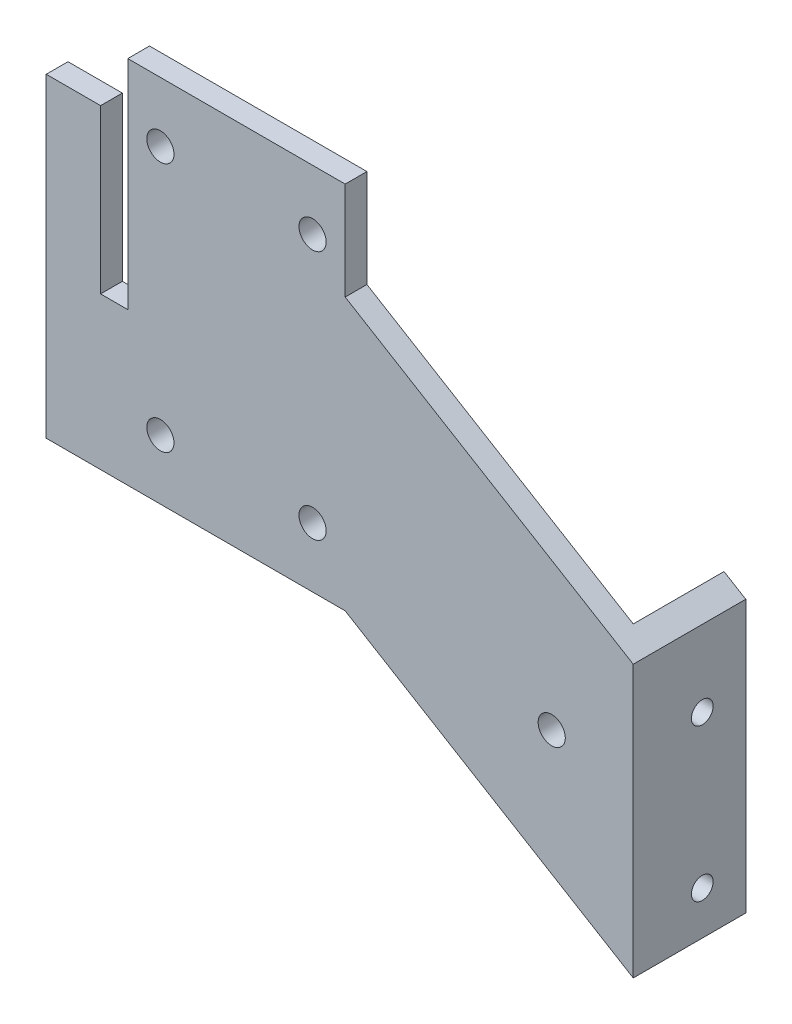
ISO-10303-21;
HEADER;
FILE_DESCRIPTION(('STEP AP214'),'2;1');
FILE_NAME('part.step','',(''),(''),'','','');
FILE_SCHEMA(('AUTOMOTIVE_DESIGN { 1 0 10303 214 1 1 1 1 }'));
ENDSEC;
DATA;
#1=APPLICATION_CONTEXT('core data for automotive mechanical design processes');
#2=APPLICATION_PROTOCOL_DEFINITION('international standard','automotive_design',2000,#1);
#3=PRODUCT_CONTEXT('',#1,'mechanical');
#4=PRODUCT('Part','Part','',(#3));
#5=PRODUCT_RELATED_PRODUCT_CATEGORY('part','',(#4));
#6=PRODUCT_DEFINITION_FORMATION('','',#4);
#7=PRODUCT_DEFINITION_CONTEXT('part definition',#1,'design');
#8=PRODUCT_DEFINITION('design','',#6,#7);
#9=PRODUCT_DEFINITION_SHAPE('','',#8);
#10=(LENGTH_UNIT() NAMED_UNIT(*) SI_UNIT(.MILLI.,.METRE.));
#11=(NAMED_UNIT(*) PLANE_ANGLE_UNIT() SI_UNIT($,.RADIAN.));
#12=(NAMED_UNIT(*) SI_UNIT($,.STERADIAN.) SOLID_ANGLE_UNIT());
#13=UNCERTAINTY_MEASURE_WITH_UNIT(LENGTH_MEASURE(1.E-05),#10,'distance_accuracy_value','');
#14=(GEOMETRIC_REPRESENTATION_CONTEXT(3) GLOBAL_UNCERTAINTY_ASSIGNED_CONTEXT((#13)) GLOBAL_UNIT_ASSIGNED_CONTEXT((#10,
#11,#12)) REPRESENTATION_CONTEXT('',''));
#15=CARTESIAN_POINT('',(0.,0.,0.));
#16=DIRECTION('',(0.,0.,1.));
#17=DIRECTION('',(1.,0.,0.));
#18=AXIS2_PLACEMENT_3D('',#15,#16,#17);
#19=CARTESIAN_POINT('',(0.,0.,4.));
#20=DIRECTION('',(0.,0.,-1.));
#21=DIRECTION('',(-1.,0.,0.));
#22=AXIS2_PLACEMENT_3D('',#19,#20,#21);
#23=PLANE('',#22);
#24=DIRECTION('',(0.,1.,0.));
#25=VECTOR('',#24,1.);
#26=CARTESIAN_POINT('',(9.99999999999999,0.,4.));
#27=LINE('',#26,#25);
#28=CARTESIAN_POINT('',(9.99999999999999,28.,4.));
#29=VERTEX_POINT('',#28);
#30=CARTESIAN_POINT('',(10.,58.,4.));
#31=VERTEX_POINT('',#30);
#32=EDGE_CURVE('E186',#29,#31,#27,.T.);
#33=ORIENTED_EDGE('',*,*,#32,.T.);
#34=DIRECTION('',(-1.,0.,0.));
#35=VECTOR('',#34,1.);
#36=CARTESIAN_POINT('',(0.,58.,4.));
#37=LINE('',#36,#35);
#38=CARTESIAN_POINT('',(0.,58.,4.));
#39=VERTEX_POINT('',#38);
#40=EDGE_CURVE('E349',#31,#39,#37,.T.);
#41=ORIENTED_EDGE('',*,*,#40,.T.);
#42=DIRECTION('',(0.,-1.,0.));
#43=VECTOR('',#42,1.);
#44=CARTESIAN_POINT('',(0.,0.,4.));
#45=LINE('',#44,#43);
#46=CARTESIAN_POINT('',(0.,0.,4.));
#47=VERTEX_POINT('',#46);
#48=EDGE_CURVE('E151',#39,#47,#45,.T.);
#49=ORIENTED_EDGE('',*,*,#48,.T.);
#50=DIRECTION('',(1.,0.,0.));
#51=VECTOR('',#50,1.);
#52=CARTESIAN_POINT('',(0.,0.,4.));
#53=LINE('',#52,#51);
#54=CARTESIAN_POINT('',(55.,0.,4.));
#55=VERTEX_POINT('',#54);
#56=EDGE_CURVE('E154',#47,#55,#53,.T.);
#57=ORIENTED_EDGE('',*,*,#56,.T.);
#58=DIRECTION('',(0.856064445274926,-0.516869099033917,0.));
#59=VECTOR('',#58,1.);
#60=CARTESIAN_POINT('',(108.,-32.,4.));
#61=LINE('',#60,#59);
#62=CARTESIAN_POINT('',(108.,-32.,4.));
#63=VERTEX_POINT('',#62);
#64=EDGE_CURVE('E245',#55,#63,#61,.T.);
#65=ORIENTED_EDGE('',*,*,#64,.T.);
#66=DIRECTION('',(0.,1.,0.));
#67=VECTOR('',#66,1.);
#68=CARTESIAN_POINT('',(108.,0.,4.));
#69=LINE('',#68,#67);
#70=CARTESIAN_POINT('',(108.,18.,4.));
#71=VERTEX_POINT('',#70);
#72=EDGE_CURVE('E247',#63,#71,#69,.T.);
#73=ORIENTED_EDGE('',*,*,#72,.T.);
#74=DIRECTION('',(-0.856064445274926,0.516869099033917,0.));
#75=VECTOR('',#74,1.);
#76=CARTESIAN_POINT('',(108.,18.,4.));
#77=LINE('',#76,#75);
#78=CARTESIAN_POINT('',(55.,50.,4.));
#79=VERTEX_POINT('',#78);
#80=EDGE_CURVE('E249',#71,#79,#77,.T.);
#81=ORIENTED_EDGE('',*,*,#80,.T.);
#82=DIRECTION('',(0.,1.,0.));
#83=VECTOR('',#82,1.);
#84=CARTESIAN_POINT('',(55.,68.,4.));
#85=LINE('',#84,#83);
#86=CARTESIAN_POINT('',(55.,68.,4.));
#87=VERTEX_POINT('',#86);
#88=EDGE_CURVE('E251',#79,#87,#85,.T.);
#89=ORIENTED_EDGE('',*,*,#88,.T.);
#90=DIRECTION('',(-1.,0.,0.));
#91=VECTOR('',#90,1.);
#92=CARTESIAN_POINT('',(0.,68.,4.));
#93=LINE('',#92,#91);
#94=CARTESIAN_POINT('',(15.,68.,4.));
#95=VERTEX_POINT('',#94);
#96=EDGE_CURVE('E162',#87,#95,#93,.T.);
#97=ORIENTED_EDGE('',*,*,#96,.T.);
#98=DIRECTION('',(0.,-1.,0.));
#99=VECTOR('',#98,1.);
#100=CARTESIAN_POINT('',(15.,0.,4.));
#101=LINE('',#100,#99);
#102=CARTESIAN_POINT('',(15.,28.,4.));
#103=VERTEX_POINT('',#102);
#104=EDGE_CURVE('E50',#95,#103,#101,.T.);
#105=ORIENTED_EDGE('',*,*,#104,.T.);
#106=DIRECTION('',(-1.,0.,0.));
#107=VECTOR('',#106,1.);
#108=CARTESIAN_POINT('',(0.,28.,4.));
#109=LINE('',#108,#107);
#110=EDGE_CURVE('E191',#103,#29,#109,.T.);
#111=ORIENTED_EDGE('',*,*,#110,.T.);
#112=EDGE_LOOP('',(#33,#41,#49,#57,#65,#73,#81,#89,#97,#105,#111));
#113=FACE_BOUND('',#112,.T.);
#114=CARTESIAN_POINT('',(21.,57.,4.));
#115=DIRECTION('',(0.,0.,1.));
#116=DIRECTION('',(1.,0.,0.));
#117=AXIS2_PLACEMENT_3D('',#114,#115,#116);
#118=CIRCLE('',#117,2.5);
#119=CARTESIAN_POINT('',(23.5,57.,4.));
#120=VERTEX_POINT('',#119);
#121=EDGE_CURVE('E238',#120,#120,#118,.T.);
#122=ORIENTED_EDGE('',*,*,#121,.F.);
#123=EDGE_LOOP('',(#122));
#124=FACE_BOUND('',#123,.T.);
#125=CARTESIAN_POINT('',(49.,57.,4.));
#126=DIRECTION('',(0.,0.,1.));
#127=DIRECTION('',(1.,0.,0.));
#128=AXIS2_PLACEMENT_3D('',#125,#126,#127);
#129=CIRCLE('',#128,2.5);
#130=CARTESIAN_POINT('',(51.5,57.,4.));
#131=VERTEX_POINT('',#130);
#132=EDGE_CURVE('E232',#131,#131,#129,.T.);
#133=ORIENTED_EDGE('',*,*,#132,.F.);
#134=EDGE_LOOP('',(#133));
#135=FACE_BOUND('',#134,.T.);
#136=CARTESIAN_POINT('',(21.,11.,4.));
#137=DIRECTION('',(0.,0.,1.));
#138=DIRECTION('',(1.,0.,0.));
#139=AXIS2_PLACEMENT_3D('',#136,#137,#138);
#140=CIRCLE('',#139,2.5);
#141=CARTESIAN_POINT('',(23.5,11.,4.));
#142=VERTEX_POINT('',#141);
#143=EDGE_CURVE('E226',#142,#142,#140,.T.);
#144=ORIENTED_EDGE('',*,*,#143,.F.);
#145=EDGE_LOOP('',(#144));
#146=FACE_BOUND('',#145,.T.);
#147=CARTESIAN_POINT('',(49.,11.,4.));
#148=DIRECTION('',(0.,0.,1.));
#149=DIRECTION('',(1.,0.,0.));
#150=AXIS2_PLACEMENT_3D('',#147,#148,#149);
#151=CIRCLE('',#150,2.5);
#152=CARTESIAN_POINT('',(51.5,11.,4.));
#153=VERTEX_POINT('',#152);
#154=EDGE_CURVE('E220',#153,#153,#151,.T.);
#155=ORIENTED_EDGE('',*,*,#154,.F.);
#156=EDGE_LOOP('',(#155));
#157=FACE_BOUND('',#156,.T.);
#158=CARTESIAN_POINT('',(93.,0.,4.));
#159=DIRECTION('',(0.,0.,1.));
#160=DIRECTION('',(1.,0.,0.));
#161=AXIS2_PLACEMENT_3D('',#158,#159,#160);
#162=CIRCLE('',#161,2.5);
#163=CARTESIAN_POINT('',(95.5,0.,4.));
#164=VERTEX_POINT('',#163);
#165=EDGE_CURVE('E214',#164,#164,#162,.T.);
#166=ORIENTED_EDGE('',*,*,#165,.F.);
#167=EDGE_LOOP('',(#166));
#168=FACE_BOUND('',#167,.T.);
#169=ADVANCED_FACE('F35',(#113,#124,#135,#146,#157,#168),#23,.F.);
#170=CARTESIAN_POINT('',(0.,0.,0.));
#171=DIRECTION('',(0.,0.,-1.));
#172=DIRECTION('',(-1.,0.,0.));
#173=AXIS2_PLACEMENT_3D('',#170,#171,#172);
#174=PLANE('',#173);
#175=DIRECTION('',(-1.,0.,0.));
#176=VECTOR('',#175,1.);
#177=CARTESIAN_POINT('',(0.,58.,0.));
#178=LINE('',#177,#176);
#179=CARTESIAN_POINT('',(10.,58.,0.));
#180=VERTEX_POINT('',#179);
#181=CARTESIAN_POINT('',(0.,58.,0.));
#182=VERTEX_POINT('',#181);
#183=EDGE_CURVE('E333',#180,#182,#178,.T.);
#184=ORIENTED_EDGE('',*,*,#183,.F.);
#185=DIRECTION('',(0.,1.,0.));
#186=VECTOR('',#185,1.);
#187=CARTESIAN_POINT('',(10.,58.,0.));
#188=LINE('',#187,#186);
#189=CARTESIAN_POINT('',(9.99999999999999,28.,0.));
#190=VERTEX_POINT('',#189);
#191=EDGE_CURVE('E335',#190,#180,#188,.T.);
#192=ORIENTED_EDGE('',*,*,#191,.F.);
#193=DIRECTION('',(-1.,0.,0.));
#194=VECTOR('',#193,1.);
#195=CARTESIAN_POINT('',(15.,28.,0.));
#196=LINE('',#195,#194);
#197=CARTESIAN_POINT('',(15.,28.,0.));
#198=VERTEX_POINT('',#197);
#199=EDGE_CURVE('E145',#198,#190,#196,.T.);
#200=ORIENTED_EDGE('',*,*,#199,.F.);
#201=DIRECTION('',(0.,-1.,0.));
#202=VECTOR('',#201,1.);
#203=CARTESIAN_POINT('',(15.,48.,0.));
#204=LINE('',#203,#202);
#205=CARTESIAN_POINT('',(15.,68.,0.));
#206=VERTEX_POINT('',#205);
#207=EDGE_CURVE('E131',#206,#198,#204,.T.);
#208=ORIENTED_EDGE('',*,*,#207,.F.);
#209=DIRECTION('',(-1.,0.,0.));
#210=VECTOR('',#209,1.);
#211=CARTESIAN_POINT('',(0.,68.,0.));
#212=LINE('',#211,#210);
#213=CARTESIAN_POINT('',(55.,68.,0.));
#214=VERTEX_POINT('',#213);
#215=EDGE_CURVE('E142',#214,#206,#212,.T.);
#216=ORIENTED_EDGE('',*,*,#215,.F.);
#217=DIRECTION('',(0.,1.,0.));
#218=VECTOR('',#217,1.);
#219=CARTESIAN_POINT('',(55.,68.,0.));
#220=LINE('',#219,#218);
#221=CARTESIAN_POINT('',(55.,50.,0.));
#222=VERTEX_POINT('',#221);
#223=EDGE_CURVE('E152',#222,#214,#220,.T.);
#224=ORIENTED_EDGE('',*,*,#223,.F.);
#225=DIRECTION('',(-0.856064445274926,0.516869099033917,0.));
#226=VECTOR('',#225,1.);
#227=CARTESIAN_POINT('',(108.,18.,0.));
#228=LINE('',#227,#226);
#229=CARTESIAN_POINT('',(104.,20.4150943396226,0.));
#230=VERTEX_POINT('',#229);
#231=EDGE_CURVE('E156',#230,#222,#228,.T.);
#232=ORIENTED_EDGE('',*,*,#231,.F.);
#233=DIRECTION('',(0.,1.,0.));
#234=VECTOR('',#233,1.);
#235=CARTESIAN_POINT('',(104.,0.,0.));
#236=LINE('',#235,#234);
#237=CARTESIAN_POINT('',(104.,-29.5849056603774,0.));
#238=VERTEX_POINT('',#237);
#239=EDGE_CURVE('E57',#238,#230,#236,.T.);
#240=ORIENTED_EDGE('',*,*,#239,.F.);
#241=DIRECTION('',(0.856064445274926,-0.516869099033917,0.));
#242=VECTOR('',#241,1.);
#243=CARTESIAN_POINT('',(108.,-32.,0.));
#244=LINE('',#243,#242);
#245=CARTESIAN_POINT('',(55.,0.,0.));
#246=VERTEX_POINT('',#245);
#247=EDGE_CURVE('E257',#246,#238,#244,.T.);
#248=ORIENTED_EDGE('',*,*,#247,.F.);
#249=DIRECTION('',(1.,0.,0.));
#250=VECTOR('',#249,1.);
#251=CARTESIAN_POINT('',(0.,0.,0.));
#252=LINE('',#251,#250);
#253=CARTESIAN_POINT('',(0.,0.,0.));
#254=VERTEX_POINT('',#253);
#255=EDGE_CURVE('E255',#254,#246,#252,.T.);
#256=ORIENTED_EDGE('',*,*,#255,.F.);
#257=DIRECTION('',(0.,-1.,0.));
#258=VECTOR('',#257,1.);
#259=CARTESIAN_POINT('',(0.,0.,0.));
#260=LINE('',#259,#258);
#261=EDGE_CURVE('E241',#182,#254,#260,.T.);
#262=ORIENTED_EDGE('',*,*,#261,.F.);
#263=EDGE_LOOP('',(#184,#192,#200,#208,#216,#224,#232,#240,#248,#256,#262));
#264=FACE_BOUND('',#263,.T.);
#265=CARTESIAN_POINT('',(49.,11.,0.));
#266=DIRECTION('',(0.,0.,1.));
#267=DIRECTION('',(1.,0.,0.));
#268=AXIS2_PLACEMENT_3D('',#265,#266,#267);
#269=CIRCLE('',#268,2.5);
#270=CARTESIAN_POINT('',(51.5,11.,0.));
#271=VERTEX_POINT('',#270);
#272=EDGE_CURVE('E217',#271,#271,#269,.T.);
#273=ORIENTED_EDGE('',*,*,#272,.T.);
#274=EDGE_LOOP('',(#273));
#275=FACE_BOUND('',#274,.T.);
#276=CARTESIAN_POINT('',(49.,57.,0.));
#277=DIRECTION('',(0.,0.,1.));
#278=DIRECTION('',(1.,0.,0.));
#279=AXIS2_PLACEMENT_3D('',#276,#277,#278);
#280=CIRCLE('',#279,2.5);
#281=CARTESIAN_POINT('',(51.5,57.,0.));
#282=VERTEX_POINT('',#281);
#283=EDGE_CURVE('E229',#282,#282,#280,.T.);
#284=ORIENTED_EDGE('',*,*,#283,.T.);
#285=EDGE_LOOP('',(#284));
#286=FACE_BOUND('',#285,.T.);
#287=CARTESIAN_POINT('',(21.,57.,0.));
#288=DIRECTION('',(0.,0.,1.));
#289=DIRECTION('',(1.,0.,0.));
#290=AXIS2_PLACEMENT_3D('',#287,#288,#289);
#291=CIRCLE('',#290,2.5);
#292=CARTESIAN_POINT('',(23.5,57.,0.));
#293=VERTEX_POINT('',#292);
#294=EDGE_CURVE('E235',#293,#293,#291,.T.);
#295=ORIENTED_EDGE('',*,*,#294,.T.);
#296=EDGE_LOOP('',(#295));
#297=FACE_BOUND('',#296,.T.);
#298=CARTESIAN_POINT('',(21.,11.,0.));
#299=DIRECTION('',(0.,0.,1.));
#300=DIRECTION('',(1.,0.,0.));
#301=AXIS2_PLACEMENT_3D('',#298,#299,#300);
#302=CIRCLE('',#301,2.5);
#303=CARTESIAN_POINT('',(23.5,11.,0.));
#304=VERTEX_POINT('',#303);
#305=EDGE_CURVE('E223',#304,#304,#302,.T.);
#306=ORIENTED_EDGE('',*,*,#305,.T.);
#307=EDGE_LOOP('',(#306));
#308=FACE_BOUND('',#307,.T.);
#309=CARTESIAN_POINT('',(93.,0.,0.));
#310=DIRECTION('',(0.,0.,1.));
#311=DIRECTION('',(1.,0.,0.));
#312=AXIS2_PLACEMENT_3D('',#309,#310,#311);
#313=CIRCLE('',#312,2.5);
#314=CARTESIAN_POINT('',(95.5,0.,0.));
#315=VERTEX_POINT('',#314);
#316=EDGE_CURVE('E213',#315,#315,#313,.T.);
#317=ORIENTED_EDGE('',*,*,#316,.T.);
#318=EDGE_LOOP('',(#317));
#319=FACE_BOUND('',#318,.T.);
#320=ADVANCED_FACE('F139',(#264,#275,#286,#297,#308,#319),#174,.T.);
#321=CARTESIAN_POINT('',(0.,0.,4.));
#322=DIRECTION('',(1.,0.,0.));
#323=DIRECTION('',(0.,0.,-1.));
#324=AXIS2_PLACEMENT_3D('',#321,#322,#323);
#325=PLANE('',#324);
#326=ORIENTED_EDGE('',*,*,#48,.F.);
#327=DIRECTION('',(0.,0.,-1.));
#328=VECTOR('',#327,1.);
#329=CARTESIAN_POINT('',(0.,58.,10.));
#330=LINE('',#329,#328);
#331=EDGE_CURVE('E332',#39,#182,#330,.T.);
#332=ORIENTED_EDGE('',*,*,#331,.T.);
#333=ORIENTED_EDGE('',*,*,#261,.T.);
#334=DIRECTION('',(0.,0.,-1.));
#335=VECTOR('',#334,1.);
#336=CARTESIAN_POINT('',(0.,0.,4.));
#337=LINE('',#336,#335);
#338=EDGE_CURVE('E43',#47,#254,#337,.T.);
#339=ORIENTED_EDGE('',*,*,#338,.F.);
#340=EDGE_LOOP('',(#326,#332,#333,#339));
#341=FACE_BOUND('',#340,.T.);
#342=ADVANCED_FACE('F37',(#341),#325,.F.);
#343=CARTESIAN_POINT('',(0.,0.,4.));
#344=DIRECTION('',(0.,1.,0.));
#345=DIRECTION('',(0.,0.,1.));
#346=AXIS2_PLACEMENT_3D('',#343,#344,#345);
#347=PLANE('',#346);
#348=ORIENTED_EDGE('',*,*,#255,.T.);
#349=DIRECTION('',(0.,0.,-1.));
#350=VECTOR('',#349,1.);
#351=CARTESIAN_POINT('',(55.,0.,4.));
#352=LINE('',#351,#350);
#353=EDGE_CURVE('E169',#55,#246,#352,.T.);
#354=ORIENTED_EDGE('',*,*,#353,.F.);
#355=ORIENTED_EDGE('',*,*,#56,.F.);
#356=ORIENTED_EDGE('',*,*,#338,.T.);
#357=EDGE_LOOP('',(#348,#354,#355,#356));
#358=FACE_BOUND('',#357,.T.);
#359=ADVANCED_FACE('F317',(#358),#347,.F.);
#360=CARTESIAN_POINT('',(108.,-32.,4.));
#361=DIRECTION('',(0.516869099033917,0.856064445274926,0.));
#362=DIRECTION('',(-0.856064445274926,0.516869099033918,0.));
#363=AXIS2_PLACEMENT_3D('',#360,#361,#362);
#364=PLANE('',#363);
#365=ORIENTED_EDGE('',*,*,#247,.T.);
#366=DIRECTION('',(0.,0.,1.));
#367=VECTOR('',#366,1.);
#368=CARTESIAN_POINT('',(104.,-29.5849056603774,-16.7));
#369=LINE('',#368,#367);
#370=CARTESIAN_POINT('',(104.,-29.5849056603774,-16.7));
#371=VERTEX_POINT('',#370);
#372=EDGE_CURVE('E207',#371,#238,#369,.T.);
#373=ORIENTED_EDGE('',*,*,#372,.F.);
#374=DIRECTION('',(0.856064445274926,-0.516869099033917,0.));
#375=VECTOR('',#374,1.);
#376=CARTESIAN_POINT('',(108.,-32.,-16.7));
#377=LINE('',#376,#375);
#378=CARTESIAN_POINT('',(108.,-32.,-16.7));
#379=VERTEX_POINT('',#378);
#380=EDGE_CURVE('E200',#371,#379,#377,.T.);
#381=ORIENTED_EDGE('',*,*,#380,.T.);
#382=DIRECTION('',(0.,0.,-1.));
#383=VECTOR('',#382,1.);
#384=CARTESIAN_POINT('',(108.,-32.,4.));
#385=LINE('',#384,#383);
#386=EDGE_CURVE('E167',#63,#379,#385,.T.);
#387=ORIENTED_EDGE('',*,*,#386,.F.);
#388=ORIENTED_EDGE('',*,*,#64,.F.);
#389=ORIENTED_EDGE('',*,*,#353,.T.);
#390=EDGE_LOOP('',(#365,#373,#381,#387,#388,#389));
#391=FACE_BOUND('',#390,.T.);
#392=ADVANCED_FACE('F280',(#391),#364,.F.);
#393=CARTESIAN_POINT('',(108.,0.,4.));
#394=DIRECTION('',(-1.,0.,0.));
#395=DIRECTION('',(0.,0.,1.));
#396=AXIS2_PLACEMENT_3D('',#393,#394,#395);
#397=PLANE('',#396);
#398=CARTESIAN_POINT('',(108.,-24.,-8.7));
#399=DIRECTION('',(1.,0.,0.));
#400=DIRECTION('',(0.,0.,-1.));
#401=AXIS2_PLACEMENT_3D('',#398,#399,#400);
#402=CIRCLE('',#401,2.);
#403=CARTESIAN_POINT('',(108.,-24.,-10.7));
#404=VERTEX_POINT('',#403);
#405=EDGE_CURVE('E180',#404,#404,#402,.T.);
#406=ORIENTED_EDGE('',*,*,#405,.F.);
#407=EDGE_LOOP('',(#406));
#408=FACE_BOUND('',#407,.T.);
#409=CARTESIAN_POINT('',(108.,4.,-8.7));
#410=DIRECTION('',(1.,0.,0.));
#411=DIRECTION('',(0.,0.,-1.));
#412=AXIS2_PLACEMENT_3D('',#409,#410,#411);
#413=CIRCLE('',#412,2.);
#414=CARTESIAN_POINT('',(108.,4.,-10.7));
#415=VERTEX_POINT('',#414);
#416=EDGE_CURVE('E177',#415,#415,#413,.T.);
#417=ORIENTED_EDGE('',*,*,#416,.F.);
#418=EDGE_LOOP('',(#417));
#419=FACE_BOUND('',#418,.T.);
#420=ORIENTED_EDGE('',*,*,#386,.T.);
#421=DIRECTION('',(0.,1.,0.));
#422=VECTOR('',#421,1.);
#423=CARTESIAN_POINT('',(108.,18.,-16.7));
#424=LINE('',#423,#422);
#425=CARTESIAN_POINT('',(108.,18.,-16.7));
#426=VERTEX_POINT('',#425);
#427=EDGE_CURVE('E203',#379,#426,#424,.T.);
#428=ORIENTED_EDGE('',*,*,#427,.T.);
#429=DIRECTION('',(0.,0.,-1.));
#430=VECTOR('',#429,1.);
#431=CARTESIAN_POINT('',(108.,18.,4.));
#432=LINE('',#431,#430);
#433=EDGE_CURVE('E165',#71,#426,#432,.T.);
#434=ORIENTED_EDGE('',*,*,#433,.F.);
#435=ORIENTED_EDGE('',*,*,#72,.F.);
#436=EDGE_LOOP('',(#420,#428,#434,#435));
#437=FACE_BOUND('',#436,.T.);
#438=ADVANCED_FACE('F276',(#408,#419,#437),#397,.F.);
#439=CARTESIAN_POINT('',(108.,18.,4.));
#440=DIRECTION('',(-0.516869099033917,-0.856064445274926,0.));
#441=DIRECTION('',(0.856064445274926,-0.516869099033918,0.));
#442=AXIS2_PLACEMENT_3D('',#439,#440,#441);
#443=PLANE('',#442);
#444=DIRECTION('',(0.,0.,-1.));
#445=VECTOR('',#444,1.);
#446=CARTESIAN_POINT('',(55.,50.,4.));
#447=LINE('',#446,#445);
#448=EDGE_CURVE('E161',#79,#222,#447,.T.);
#449=ORIENTED_EDGE('',*,*,#448,.F.);
#450=ORIENTED_EDGE('',*,*,#80,.F.);
#451=ORIENTED_EDGE('',*,*,#433,.T.);
#452=DIRECTION('',(-0.856064445274926,0.516869099033917,0.));
#453=VECTOR('',#452,1.);
#454=CARTESIAN_POINT('',(104.,20.4150943396226,-16.7));
#455=LINE('',#454,#453);
#456=CARTESIAN_POINT('',(104.,20.4150943396226,-16.7));
#457=VERTEX_POINT('',#456);
#458=EDGE_CURVE('E176',#426,#457,#455,.T.);
#459=ORIENTED_EDGE('',*,*,#458,.T.);
#460=DIRECTION('',(0.,0.,1.));
#461=VECTOR('',#460,1.);
#462=CARTESIAN_POINT('',(104.,20.4150943396226,-16.7));
#463=LINE('',#462,#461);
#464=EDGE_CURVE('E206',#457,#230,#463,.T.);
#465=ORIENTED_EDGE('',*,*,#464,.T.);
#466=ORIENTED_EDGE('',*,*,#231,.T.);
#467=EDGE_LOOP('',(#449,#450,#451,#459,#465,#466));
#468=FACE_BOUND('',#467,.T.);
#469=ADVANCED_FACE('F260',(#468),#443,.F.);
#470=CARTESIAN_POINT('',(55.,68.,4.));
#471=DIRECTION('',(-1.,0.,0.));
#472=DIRECTION('',(0.,-1.,0.));
#473=AXIS2_PLACEMENT_3D('',#470,#471,#472);
#474=PLANE('',#473);
#475=ORIENTED_EDGE('',*,*,#223,.T.);
#476=DIRECTION('',(0.,0.,-1.));
#477=VECTOR('',#476,1.);
#478=CARTESIAN_POINT('',(55.,68.,4.));
#479=LINE('',#478,#477);
#480=EDGE_CURVE('E150',#87,#214,#479,.T.);
#481=ORIENTED_EDGE('',*,*,#480,.F.);
#482=ORIENTED_EDGE('',*,*,#88,.F.);
#483=ORIENTED_EDGE('',*,*,#448,.T.);
#484=EDGE_LOOP('',(#475,#481,#482,#483));
#485=FACE_BOUND('',#484,.T.);
#486=ADVANCED_FACE('F264',(#485),#474,.F.);
#487=CARTESIAN_POINT('',(0.,68.,4.));
#488=DIRECTION('',(0.,-1.,0.));
#489=DIRECTION('',(0.,0.,-1.));
#490=AXIS2_PLACEMENT_3D('',#487,#488,#489);
#491=PLANE('',#490);
#492=ORIENTED_EDGE('',*,*,#215,.T.);
#493=DIRECTION('',(0.,0.,1.));
#494=VECTOR('',#493,1.);
#495=CARTESIAN_POINT('',(15.,68.,4.));
#496=LINE('',#495,#494);
#497=EDGE_CURVE('E11',#206,#95,#496,.T.);
#498=ORIENTED_EDGE('',*,*,#497,.T.);
#499=ORIENTED_EDGE('',*,*,#96,.F.);
#500=ORIENTED_EDGE('',*,*,#480,.T.);
#501=EDGE_LOOP('',(#492,#498,#499,#500));
#502=FACE_BOUND('',#501,.T.);
#503=ADVANCED_FACE('F148',(#502),#491,.F.);
#504=CARTESIAN_POINT('',(21.,57.,4.));
#505=DIRECTION('',(0.,0.,-1.));
#506=DIRECTION('',(-1.,0.,0.));
#507=AXIS2_PLACEMENT_3D('',#504,#505,#506);
#508=CYLINDRICAL_SURFACE('',#507,2.5);
#509=ORIENTED_EDGE('',*,*,#121,.T.);
#510=EDGE_LOOP('',(#509));
#511=FACE_BOUND('',#510,.T.);
#512=ORIENTED_EDGE('',*,*,#294,.F.);
#513=EDGE_LOOP('',(#512));
#514=FACE_BOUND('',#513,.T.);
#515=ADVANCED_FACE('F304',(#511,#514),#508,.F.);
#516=CARTESIAN_POINT('',(49.,57.,4.));
#517=DIRECTION('',(0.,0.,-1.));
#518=DIRECTION('',(-1.,0.,0.));
#519=AXIS2_PLACEMENT_3D('',#516,#517,#518);
#520=CYLINDRICAL_SURFACE('',#519,2.5);
#521=ORIENTED_EDGE('',*,*,#132,.T.);
#522=EDGE_LOOP('',(#521));
#523=FACE_BOUND('',#522,.T.);
#524=ORIENTED_EDGE('',*,*,#283,.F.);
#525=EDGE_LOOP('',(#524));
#526=FACE_BOUND('',#525,.T.);
#527=ADVANCED_FACE('F473',(#523,#526),#520,.F.);
#528=CARTESIAN_POINT('',(21.,11.,4.));
#529=DIRECTION('',(0.,0.,-1.));
#530=DIRECTION('',(-1.,0.,0.));
#531=AXIS2_PLACEMENT_3D('',#528,#529,#530);
#532=CYLINDRICAL_SURFACE('',#531,2.5);
#533=ORIENTED_EDGE('',*,*,#143,.T.);
#534=EDGE_LOOP('',(#533));
#535=FACE_BOUND('',#534,.T.);
#536=ORIENTED_EDGE('',*,*,#305,.F.);
#537=EDGE_LOOP('',(#536));
#538=FACE_BOUND('',#537,.T.);
#539=ADVANCED_FACE('F464',(#535,#538),#532,.F.);
#540=CARTESIAN_POINT('',(49.,11.,4.));
#541=DIRECTION('',(0.,0.,-1.));
#542=DIRECTION('',(-1.,0.,0.));
#543=AXIS2_PLACEMENT_3D('',#540,#541,#542);
#544=CYLINDRICAL_SURFACE('',#543,2.5);
#545=ORIENTED_EDGE('',*,*,#154,.T.);
#546=EDGE_LOOP('',(#545));
#547=FACE_BOUND('',#546,.T.);
#548=ORIENTED_EDGE('',*,*,#272,.F.);
#549=EDGE_LOOP('',(#548));
#550=FACE_BOUND('',#549,.T.);
#551=ADVANCED_FACE('F293',(#547,#550),#544,.F.);
#552=CARTESIAN_POINT('',(93.,0.,4.));
#553=DIRECTION('',(0.,0.,-1.));
#554=DIRECTION('',(-1.,0.,0.));
#555=AXIS2_PLACEMENT_3D('',#552,#553,#554);
#556=CYLINDRICAL_SURFACE('',#555,2.5);
#557=ORIENTED_EDGE('',*,*,#165,.T.);
#558=EDGE_LOOP('',(#557));
#559=FACE_BOUND('',#558,.T.);
#560=ORIENTED_EDGE('',*,*,#316,.F.);
#561=EDGE_LOOP('',(#560));
#562=FACE_BOUND('',#561,.T.);
#563=ADVANCED_FACE('F284',(#559,#562),#556,.F.);
#564=CARTESIAN_POINT('',(104.,20.4150943396226,-16.7));
#565=DIRECTION('',(-1.,0.,0.));
#566=DIRECTION('',(0.,-1.,0.));
#567=AXIS2_PLACEMENT_3D('',#564,#565,#566);
#568=PLANE('',#567);
#569=CARTESIAN_POINT('',(104.,-24.,-8.7));
#570=DIRECTION('',(-1.,0.,0.));
#571=DIRECTION('',(0.,-1.,0.));
#572=AXIS2_PLACEMENT_3D('',#569,#570,#571);
#573=CIRCLE('',#572,2.);
#574=CARTESIAN_POINT('',(104.,-26.,-8.7));
#575=VERTEX_POINT('',#574);
#576=EDGE_CURVE('E178',#575,#575,#573,.T.);
#577=ORIENTED_EDGE('',*,*,#576,.F.);
#578=EDGE_LOOP('',(#577));
#579=FACE_BOUND('',#578,.T.);
#580=CARTESIAN_POINT('',(104.,4.,-8.7));
#581=DIRECTION('',(-1.,0.,0.));
#582=DIRECTION('',(0.,-1.,0.));
#583=AXIS2_PLACEMENT_3D('',#580,#581,#582);
#584=CIRCLE('',#583,2.);
#585=CARTESIAN_POINT('',(104.,2.,-8.7));
#586=VERTEX_POINT('',#585);
#587=EDGE_CURVE('E174',#586,#586,#584,.T.);
#588=ORIENTED_EDGE('',*,*,#587,.F.);
#589=EDGE_LOOP('',(#588));
#590=FACE_BOUND('',#589,.T.);
#591=ORIENTED_EDGE('',*,*,#372,.T.);
#592=ORIENTED_EDGE('',*,*,#239,.T.);
#593=ORIENTED_EDGE('',*,*,#464,.F.);
#594=DIRECTION('',(0.,-1.,0.));
#595=VECTOR('',#594,1.);
#596=CARTESIAN_POINT('',(104.,20.4150943396226,-16.7));
#597=LINE('',#596,#595);
#598=EDGE_CURVE('E197',#457,#371,#597,.T.);
#599=ORIENTED_EDGE('',*,*,#598,.T.);
#600=EDGE_LOOP('',(#591,#592,#593,#599));
#601=FACE_BOUND('',#600,.T.);
#602=ADVANCED_FACE('F282',(#579,#590,#601),#568,.T.);
#603=CARTESIAN_POINT('',(0.,0.,-16.7));
#604=DIRECTION('',(0.,0.,-1.));
#605=DIRECTION('',(-1.,0.,0.));
#606=AXIS2_PLACEMENT_3D('',#603,#604,#605);
#607=PLANE('',#606);
#608=ORIENTED_EDGE('',*,*,#458,.F.);
#609=ORIENTED_EDGE('',*,*,#427,.F.);
#610=ORIENTED_EDGE('',*,*,#380,.F.);
#611=ORIENTED_EDGE('',*,*,#598,.F.);
#612=EDGE_LOOP('',(#608,#609,#610,#611));
#613=FACE_BOUND('',#612,.T.);
#614=ADVANCED_FACE('F274',(#613),#607,.T.);
#615=CARTESIAN_POINT('',(101.3,4.,-8.7));
#616=DIRECTION('',(1.,0.,0.));
#617=DIRECTION('',(0.,0.,-1.));
#618=AXIS2_PLACEMENT_3D('',#615,#616,#617);
#619=CYLINDRICAL_SURFACE('',#618,2.);
#620=ORIENTED_EDGE('',*,*,#587,.T.);
#621=EDGE_LOOP('',(#620));
#622=FACE_BOUND('',#621,.T.);
#623=ORIENTED_EDGE('',*,*,#416,.T.);
#624=EDGE_LOOP('',(#623));
#625=FACE_BOUND('',#624,.T.);
#626=ADVANCED_FACE('F291',(#622,#625),#619,.F.);
#627=CARTESIAN_POINT('',(101.3,-24.,-8.7));
#628=DIRECTION('',(1.,0.,0.));
#629=DIRECTION('',(0.,0.,-1.));
#630=AXIS2_PLACEMENT_3D('',#627,#628,#629);
#631=CYLINDRICAL_SURFACE('',#630,2.);
#632=ORIENTED_EDGE('',*,*,#576,.T.);
#633=EDGE_LOOP('',(#632));
#634=FACE_BOUND('',#633,.T.);
#635=ORIENTED_EDGE('',*,*,#405,.T.);
#636=EDGE_LOOP('',(#635));
#637=FACE_BOUND('',#636,.T.);
#638=ADVANCED_FACE('F368',(#634,#637),#631,.F.);
#639=CARTESIAN_POINT('',(10.,58.,10.));
#640=DIRECTION('',(-1.,0.,0.));
#641=DIRECTION('',(0.,-1.,0.));
#642=AXIS2_PLACEMENT_3D('',#639,#640,#641);
#643=PLANE('',#642);
#644=DIRECTION('',(0.,0.,-1.));
#645=VECTOR('',#644,1.);
#646=CARTESIAN_POINT('',(9.99999999999999,28.,10.));
#647=LINE('',#646,#645);
#648=EDGE_CURVE('E339',#29,#190,#647,.T.);
#649=ORIENTED_EDGE('',*,*,#648,.T.);
#650=ORIENTED_EDGE('',*,*,#191,.T.);
#651=DIRECTION('',(0.,0.,-1.));
#652=VECTOR('',#651,1.);
#653=CARTESIAN_POINT('',(10.,58.,10.));
#654=LINE('',#653,#652);
#655=EDGE_CURVE('E345',#31,#180,#654,.T.);
#656=ORIENTED_EDGE('',*,*,#655,.F.);
#657=ORIENTED_EDGE('',*,*,#32,.F.);
#658=EDGE_LOOP('',(#649,#650,#656,#657));
#659=FACE_BOUND('',#658,.T.);
#660=ADVANCED_FACE('F355',(#659),#643,.F.);
#661=CARTESIAN_POINT('',(15.,28.,10.));
#662=DIRECTION('',(0.,-1.,0.));
#663=DIRECTION('',(1.,0.,0.));
#664=AXIS2_PLACEMENT_3D('',#661,#662,#663);
#665=PLANE('',#664);
#666=DIRECTION('',(0.,0.,-1.));
#667=VECTOR('',#666,1.);
#668=CARTESIAN_POINT('',(15.,28.,10.));
#669=LINE('',#668,#667);
#670=EDGE_CURVE('E337',#103,#198,#669,.T.);
#671=ORIENTED_EDGE('',*,*,#670,.T.);
#672=ORIENTED_EDGE('',*,*,#199,.T.);
#673=ORIENTED_EDGE('',*,*,#648,.F.);
#674=ORIENTED_EDGE('',*,*,#110,.F.);
#675=EDGE_LOOP('',(#671,#672,#673,#674));
#676=FACE_BOUND('',#675,.T.);
#677=ADVANCED_FACE('F353',(#676),#665,.F.);
#678=CARTESIAN_POINT('',(0.,58.,10.));
#679=DIRECTION('',(0.,-1.,0.));
#680=DIRECTION('',(0.,0.,-1.));
#681=AXIS2_PLACEMENT_3D('',#678,#679,#680);
#682=PLANE('',#681);
#683=ORIENTED_EDGE('',*,*,#655,.T.);
#684=ORIENTED_EDGE('',*,*,#183,.T.);
#685=ORIENTED_EDGE('',*,*,#331,.F.);
#686=ORIENTED_EDGE('',*,*,#40,.F.);
#687=EDGE_LOOP('',(#683,#684,#685,#686));
#688=FACE_BOUND('',#687,.T.);
#689=ADVANCED_FACE('F357',(#688),#682,.F.);
#690=CARTESIAN_POINT('',(15.,48.,10.));
#691=DIRECTION('',(1.,0.,0.));
#692=DIRECTION('',(0.,1.,0.));
#693=AXIS2_PLACEMENT_3D('',#690,#691,#692);
#694=PLANE('',#693);
#695=ORIENTED_EDGE('',*,*,#497,.F.);
#696=ORIENTED_EDGE('',*,*,#207,.T.);
#697=ORIENTED_EDGE('',*,*,#670,.F.);
#698=ORIENTED_EDGE('',*,*,#104,.F.);
#699=EDGE_LOOP('',(#695,#696,#697,#698));
#700=FACE_BOUND('',#699,.T.);
#701=ADVANCED_FACE('F130',(#700),#694,.F.);
#702=CLOSED_SHELL('',(#169,#320,#342,#359,#392,#438,#469,#486,#503,#515,#527,#539,#551,#563,
#602,#614,#626,#638,#660,#677,#689,#701));
#703=MANIFOLD_SOLID_BREP('B2',#702);
#704=ADVANCED_BREP_SHAPE_REPRESENTATION('',(#18,#703),#14);
#705=SHAPE_DEFINITION_REPRESENTATION(#9,#704);
ENDSEC;
END-ISO-10303-21;
